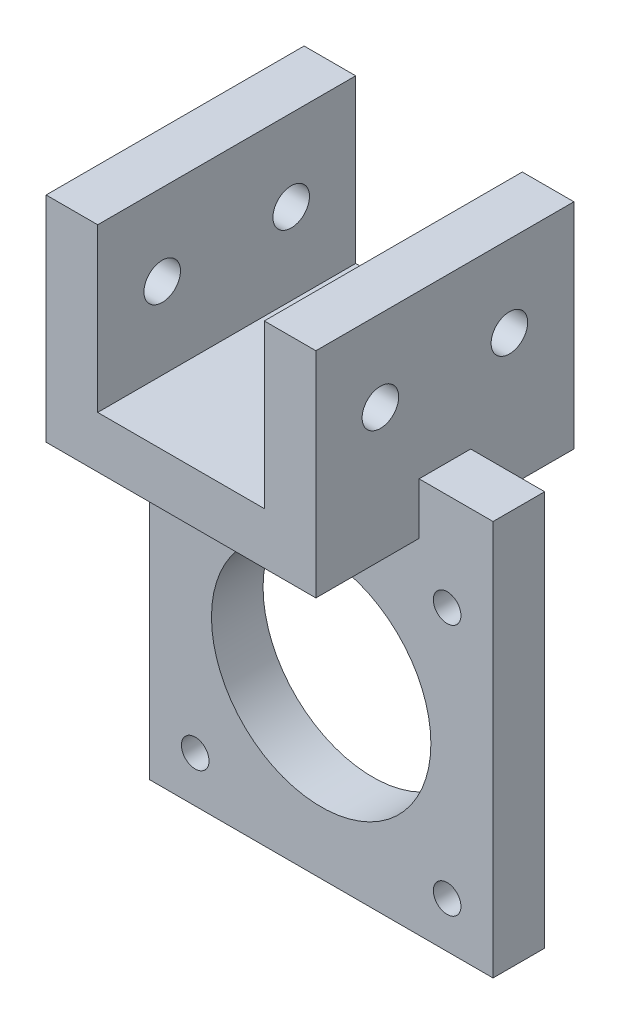
ISO-10303-21;
HEADER;
FILE_DESCRIPTION(('STEP AP214'),'2;1');
FILE_NAME('part.step','',(''),(''),'','','');
FILE_SCHEMA(('AUTOMOTIVE_DESIGN { 1 0 10303 214 1 1 1 1 }'));
ENDSEC;
DATA;
#1=APPLICATION_CONTEXT('core data for automotive mechanical design processes');
#2=APPLICATION_PROTOCOL_DEFINITION('international standard','automotive_design',2000,#1);
#3=PRODUCT_CONTEXT('',#1,'mechanical');
#4=PRODUCT('Part','Part','',(#3));
#5=PRODUCT_RELATED_PRODUCT_CATEGORY('part','',(#4));
#6=PRODUCT_DEFINITION_FORMATION('','',#4);
#7=PRODUCT_DEFINITION_CONTEXT('part definition',#1,'design');
#8=PRODUCT_DEFINITION('design','',#6,#7);
#9=PRODUCT_DEFINITION_SHAPE('','',#8);
#10=(LENGTH_UNIT() NAMED_UNIT(*) SI_UNIT(.MILLI.,.METRE.));
#11=(NAMED_UNIT(*) PLANE_ANGLE_UNIT() SI_UNIT($,.RADIAN.));
#12=(NAMED_UNIT(*) SI_UNIT($,.STERADIAN.) SOLID_ANGLE_UNIT());
#13=UNCERTAINTY_MEASURE_WITH_UNIT(LENGTH_MEASURE(1.E-05),#10,'distance_accuracy_value','');
#14=(GEOMETRIC_REPRESENTATION_CONTEXT(3) GLOBAL_UNCERTAINTY_ASSIGNED_CONTEXT((#13)) GLOBAL_UNIT_ASSIGNED_CONTEXT((#10,
#11,#12)) REPRESENTATION_CONTEXT('',''));
#15=CARTESIAN_POINT('',(0.,0.,0.));
#16=DIRECTION('',(0.,0.,1.));
#17=DIRECTION('',(1.,0.,0.));
#18=AXIS2_PLACEMENT_3D('',#15,#16,#17);
#19=CARTESIAN_POINT('',(0.,27.5,0.));
#20=DIRECTION('',(0.,1.,0.));
#21=DIRECTION('',(0.,0.,1.));
#22=AXIS2_PLACEMENT_3D('',#19,#20,#21);
#23=PLANE('',#22);
#24=DIRECTION('',(0.,0.,1.));
#25=VECTOR('',#24,1.);
#26=CARTESIAN_POINT('',(5.70000000000001,27.5,6.35));
#27=LINE('',#26,#25);
#28=CARTESIAN_POINT('',(5.70000000000001,27.5,-12.7));
#29=VERTEX_POINT('',#28);
#30=CARTESIAN_POINT('',(5.70000000000001,27.5,19.05));
#31=VERTEX_POINT('',#30);
#32=EDGE_CURVE('E146',#29,#31,#27,.T.);
#33=ORIENTED_EDGE('',*,*,#32,.F.);
#34=DIRECTION('',(1.,0.,0.));
#35=VECTOR('',#34,1.);
#36=CARTESIAN_POINT('',(-14.8,27.5,-12.7));
#37=LINE('',#36,#35);
#38=CARTESIAN_POINT('',(-14.8,27.5,-12.7));
#39=VERTEX_POINT('',#38);
#40=EDGE_CURVE('E179',#39,#29,#37,.T.);
#41=ORIENTED_EDGE('',*,*,#40,.F.);
#42=DIRECTION('',(0.,0.,-1.));
#43=VECTOR('',#42,1.);
#44=CARTESIAN_POINT('',(-14.8,27.5,0.));
#45=LINE('',#44,#43);
#46=CARTESIAN_POINT('',(-14.8,27.5,19.05));
#47=VERTEX_POINT('',#46);
#48=EDGE_CURVE('E215',#47,#39,#45,.T.);
#49=ORIENTED_EDGE('',*,*,#48,.F.);
#50=DIRECTION('',(1.,0.,0.));
#51=VECTOR('',#50,1.);
#52=CARTESIAN_POINT('',(-14.8,27.5,19.05));
#53=LINE('',#52,#51);
#54=EDGE_CURVE('E197',#47,#31,#53,.T.);
#55=ORIENTED_EDGE('',*,*,#54,.T.);
#56=EDGE_LOOP('',(#33,#41,#49,#55));
#57=FACE_BOUND('',#56,.T.);
#58=ADVANCED_FACE('F35',(#57),#23,.T.);
#59=DIRECTION('',(0.,0.,-1.));
#60=VECTOR('',#59,1.);
#61=CARTESIAN_POINT('',(12.05,27.5,6.35));
#62=LINE('',#61,#60);
#63=CARTESIAN_POINT('',(12.05,27.5,6.35));
#64=VERTEX_POINT('',#63);
#65=CARTESIAN_POINT('',(12.05,27.5,0.));
#66=VERTEX_POINT('',#65);
#67=EDGE_CURVE('E220',#64,#66,#62,.T.);
#68=ORIENTED_EDGE('',*,*,#67,.F.);
#69=DIRECTION('',(1.,0.,0.));
#70=VECTOR('',#69,1.);
#71=CARTESIAN_POINT('',(0.,27.5,6.35));
#72=LINE('',#71,#70);
#73=CARTESIAN_POINT('',(21.15,27.5,6.35));
#74=VERTEX_POINT('',#73);
#75=EDGE_CURVE('E231',#64,#74,#72,.T.);
#76=ORIENTED_EDGE('',*,*,#75,.T.);
#77=DIRECTION('',(0.,0.,-1.));
#78=VECTOR('',#77,1.);
#79=CARTESIAN_POINT('',(21.15,27.5,0.));
#80=LINE('',#79,#78);
#81=CARTESIAN_POINT('',(21.15,27.5,0.));
#82=VERTEX_POINT('',#81);
#83=EDGE_CURVE('E223',#74,#82,#80,.T.);
#84=ORIENTED_EDGE('',*,*,#83,.T.);
#85=DIRECTION('',(-1.,0.,0.));
#86=VECTOR('',#85,1.);
#87=CARTESIAN_POINT('',(0.,27.5,0.));
#88=LINE('',#87,#86);
#89=EDGE_CURVE('E228',#82,#66,#88,.T.);
#90=ORIENTED_EDGE('',*,*,#89,.T.);
#91=EDGE_LOOP('',(#68,#76,#84,#90));
#92=FACE_BOUND('',#91,.T.);
#93=ADVANCED_FACE('F323',(#92),#23,.T.);
#94=CARTESIAN_POINT('',(0.,-21.15,6.35));
#95=DIRECTION('',(0.,1.,0.));
#96=DIRECTION('',(0.,0.,1.));
#97=AXIS2_PLACEMENT_3D('',#94,#95,#96);
#98=PLANE('',#97);
#99=DIRECTION('',(1.,0.,0.));
#100=VECTOR('',#99,1.);
#101=CARTESIAN_POINT('',(0.,-21.15,0.));
#102=LINE('',#101,#100);
#103=CARTESIAN_POINT('',(-21.15,-21.15,0.));
#104=VERTEX_POINT('',#103);
#105=CARTESIAN_POINT('',(21.15,-21.15,0.));
#106=VERTEX_POINT('',#105);
#107=EDGE_CURVE('E273',#104,#106,#102,.T.);
#108=ORIENTED_EDGE('',*,*,#107,.T.);
#109=DIRECTION('',(0.,0.,-1.));
#110=VECTOR('',#109,1.);
#111=CARTESIAN_POINT('',(21.15,-21.15,6.35));
#112=LINE('',#111,#110);
#113=CARTESIAN_POINT('',(21.15,-21.15,6.35));
#114=VERTEX_POINT('',#113);
#115=EDGE_CURVE('E44',#114,#106,#112,.T.);
#116=ORIENTED_EDGE('',*,*,#115,.F.);
#117=DIRECTION('',(1.,0.,0.));
#118=VECTOR('',#117,1.);
#119=CARTESIAN_POINT('',(0.,-21.15,6.35));
#120=LINE('',#119,#118);
#121=CARTESIAN_POINT('',(-21.15,-21.15,6.35));
#122=VERTEX_POINT('',#121);
#123=EDGE_CURVE('E249',#122,#114,#120,.T.);
#124=ORIENTED_EDGE('',*,*,#123,.F.);
#125=DIRECTION('',(0.,0.,-1.));
#126=VECTOR('',#125,1.);
#127=CARTESIAN_POINT('',(-21.15,-21.15,6.35));
#128=LINE('',#127,#126);
#129=EDGE_CURVE('E258',#122,#104,#128,.T.);
#130=ORIENTED_EDGE('',*,*,#129,.T.);
#131=EDGE_LOOP('',(#108,#116,#124,#130));
#132=FACE_BOUND('',#131,.T.);
#133=ADVANCED_FACE('F328',(#132),#98,.F.);
#134=CARTESIAN_POINT('',(21.15,0.,6.35));
#135=DIRECTION('',(-1.,0.,0.));
#136=DIRECTION('',(0.,0.,1.));
#137=AXIS2_PLACEMENT_3D('',#134,#135,#136);
#138=PLANE('',#137);
#139=DIRECTION('',(0.,1.,0.));
#140=VECTOR('',#139,1.);
#141=CARTESIAN_POINT('',(21.15,0.,0.));
#142=LINE('',#141,#140);
#143=EDGE_CURVE('E276',#106,#82,#142,.T.);
#144=ORIENTED_EDGE('',*,*,#143,.T.);
#145=ORIENTED_EDGE('',*,*,#83,.F.);
#146=DIRECTION('',(0.,1.,0.));
#147=VECTOR('',#146,1.);
#148=CARTESIAN_POINT('',(21.15,0.,6.35));
#149=LINE('',#148,#147);
#150=EDGE_CURVE('E252',#114,#74,#149,.T.);
#151=ORIENTED_EDGE('',*,*,#150,.F.);
#152=ORIENTED_EDGE('',*,*,#115,.T.);
#153=EDGE_LOOP('',(#144,#145,#151,#152));
#154=FACE_BOUND('',#153,.T.);
#155=ADVANCED_FACE('F337',(#154),#138,.F.);
#156=CARTESIAN_POINT('',(-15.5,15.5,6.35));
#157=DIRECTION('',(0.,0.,-1.));
#158=DIRECTION('',(-1.,0.,0.));
#159=AXIS2_PLACEMENT_3D('',#156,#157,#158);
#160=CYLINDRICAL_SURFACE('',#159,1.7);
#161=CARTESIAN_POINT('',(-15.5,15.5,6.35));
#162=DIRECTION('',(0.,0.,1.));
#163=DIRECTION('',(1.,0.,0.));
#164=AXIS2_PLACEMENT_3D('',#161,#162,#163);
#165=CIRCLE('',#164,1.7);
#166=CARTESIAN_POINT('',(-13.8,15.5,6.35));
#167=VERTEX_POINT('',#166);
#168=EDGE_CURVE('E246',#167,#167,#165,.T.);
#169=ORIENTED_EDGE('',*,*,#168,.T.);
#170=EDGE_LOOP('',(#169));
#171=FACE_BOUND('',#170,.T.);
#172=CARTESIAN_POINT('',(-15.5,15.5,0.));
#173=DIRECTION('',(0.,0.,1.));
#174=DIRECTION('',(1.,0.,0.));
#175=AXIS2_PLACEMENT_3D('',#172,#173,#174);
#176=CIRCLE('',#175,1.7);
#177=CARTESIAN_POINT('',(-13.8,15.5,0.));
#178=VERTEX_POINT('',#177);
#179=EDGE_CURVE('E270',#178,#178,#176,.T.);
#180=ORIENTED_EDGE('',*,*,#179,.F.);
#181=EDGE_LOOP('',(#180));
#182=FACE_BOUND('',#181,.T.);
#183=ADVANCED_FACE('F340',(#171,#182),#160,.F.);
#184=CARTESIAN_POINT('',(0.,0.,6.35));
#185=DIRECTION('',(0.,0.,-1.));
#186=DIRECTION('',(-1.,0.,0.));
#187=AXIS2_PLACEMENT_3D('',#184,#185,#186);
#188=CYLINDRICAL_SURFACE('',#187,13.5);
#189=CARTESIAN_POINT('',(0.,0.,6.35));
#190=DIRECTION('',(0.,0.,1.));
#191=DIRECTION('',(1.,0.,0.));
#192=AXIS2_PLACEMENT_3D('',#189,#190,#191);
#193=CIRCLE('',#192,13.5);
#194=CARTESIAN_POINT('',(13.5,0.,6.35));
#195=VERTEX_POINT('',#194);
#196=EDGE_CURVE('E243',#195,#195,#193,.T.);
#197=ORIENTED_EDGE('',*,*,#196,.T.);
#198=EDGE_LOOP('',(#197));
#199=FACE_BOUND('',#198,.T.);
#200=CARTESIAN_POINT('',(0.,0.,0.));
#201=DIRECTION('',(0.,0.,1.));
#202=DIRECTION('',(1.,0.,0.));
#203=AXIS2_PLACEMENT_3D('',#200,#201,#202);
#204=CIRCLE('',#203,13.5);
#205=CARTESIAN_POINT('',(13.5,0.,0.));
#206=VERTEX_POINT('',#205);
#207=EDGE_CURVE('E267',#206,#206,#204,.T.);
#208=ORIENTED_EDGE('',*,*,#207,.F.);
#209=EDGE_LOOP('',(#208));
#210=FACE_BOUND('',#209,.T.);
#211=ADVANCED_FACE('F347',(#199,#210),#188,.F.);
#212=CARTESIAN_POINT('',(-15.5,-15.5,6.35));
#213=DIRECTION('',(0.,0.,-1.));
#214=DIRECTION('',(-1.,0.,0.));
#215=AXIS2_PLACEMENT_3D('',#212,#213,#214);
#216=CYLINDRICAL_SURFACE('',#215,1.7);
#217=CARTESIAN_POINT('',(-15.5,-15.5,6.35));
#218=DIRECTION('',(0.,0.,1.));
#219=DIRECTION('',(1.,0.,0.));
#220=AXIS2_PLACEMENT_3D('',#217,#218,#219);
#221=CIRCLE('',#220,1.7);
#222=CARTESIAN_POINT('',(-13.8,-15.5,6.35));
#223=VERTEX_POINT('',#222);
#224=EDGE_CURVE('E240',#223,#223,#221,.T.);
#225=ORIENTED_EDGE('',*,*,#224,.T.);
#226=EDGE_LOOP('',(#225));
#227=FACE_BOUND('',#226,.T.);
#228=CARTESIAN_POINT('',(-15.5,-15.5,0.));
#229=DIRECTION('',(0.,0.,1.));
#230=DIRECTION('',(1.,0.,0.));
#231=AXIS2_PLACEMENT_3D('',#228,#229,#230);
#232=CIRCLE('',#231,1.7);
#233=CARTESIAN_POINT('',(-13.8,-15.5,0.));
#234=VERTEX_POINT('',#233);
#235=EDGE_CURVE('E264',#234,#234,#232,.T.);
#236=ORIENTED_EDGE('',*,*,#235,.F.);
#237=EDGE_LOOP('',(#236));
#238=FACE_BOUND('',#237,.T.);
#239=ADVANCED_FACE('F351',(#227,#238),#216,.F.);
#240=CARTESIAN_POINT('',(15.5,15.5,6.35));
#241=DIRECTION('',(0.,0.,-1.));
#242=DIRECTION('',(-1.,0.,0.));
#243=AXIS2_PLACEMENT_3D('',#240,#241,#242);
#244=CYLINDRICAL_SURFACE('',#243,1.7);
#245=CARTESIAN_POINT('',(15.5,15.5,6.35));
#246=DIRECTION('',(0.,0.,1.));
#247=DIRECTION('',(1.,0.,0.));
#248=AXIS2_PLACEMENT_3D('',#245,#246,#247);
#249=CIRCLE('',#248,1.7);
#250=CARTESIAN_POINT('',(17.2,15.5,6.35));
#251=VERTEX_POINT('',#250);
#252=EDGE_CURVE('E237',#251,#251,#249,.T.);
#253=ORIENTED_EDGE('',*,*,#252,.T.);
#254=EDGE_LOOP('',(#253));
#255=FACE_BOUND('',#254,.T.);
#256=CARTESIAN_POINT('',(15.5,15.5,0.));
#257=DIRECTION('',(0.,0.,1.));
#258=DIRECTION('',(1.,0.,0.));
#259=AXIS2_PLACEMENT_3D('',#256,#257,#258);
#260=CIRCLE('',#259,1.7);
#261=CARTESIAN_POINT('',(17.2,15.5,0.));
#262=VERTEX_POINT('',#261);
#263=EDGE_CURVE('E261',#262,#262,#260,.T.);
#264=ORIENTED_EDGE('',*,*,#263,.F.);
#265=EDGE_LOOP('',(#264));
#266=FACE_BOUND('',#265,.T.);
#267=ADVANCED_FACE('F354',(#255,#266),#244,.F.);
#268=CARTESIAN_POINT('',(15.5,-15.5,6.35));
#269=DIRECTION('',(0.,0.,-1.));
#270=DIRECTION('',(-1.,0.,0.));
#271=AXIS2_PLACEMENT_3D('',#268,#269,#270);
#272=CYLINDRICAL_SURFACE('',#271,1.7);
#273=CARTESIAN_POINT('',(15.5,-15.5,6.35));
#274=DIRECTION('',(0.,0.,1.));
#275=DIRECTION('',(1.,0.,0.));
#276=AXIS2_PLACEMENT_3D('',#273,#274,#275);
#277=CIRCLE('',#276,1.7);
#278=CARTESIAN_POINT('',(17.2,-15.5,6.35));
#279=VERTEX_POINT('',#278);
#280=EDGE_CURVE('E234',#279,#279,#277,.T.);
#281=ORIENTED_EDGE('',*,*,#280,.T.);
#282=EDGE_LOOP('',(#281));
#283=FACE_BOUND('',#282,.T.);
#284=CARTESIAN_POINT('',(15.5,-15.5,0.));
#285=DIRECTION('',(0.,0.,1.));
#286=DIRECTION('',(1.,0.,0.));
#287=AXIS2_PLACEMENT_3D('',#284,#285,#286);
#288=CIRCLE('',#287,1.7);
#289=CARTESIAN_POINT('',(17.2,-15.5,0.));
#290=VERTEX_POINT('',#289);
#291=EDGE_CURVE('E233',#290,#290,#288,.T.);
#292=ORIENTED_EDGE('',*,*,#291,.F.);
#293=EDGE_LOOP('',(#292));
#294=FACE_BOUND('',#293,.T.);
#295=ADVANCED_FACE('F37',(#283,#294),#272,.F.);
#296=CARTESIAN_POINT('',(-21.15,0.,6.35));
#297=DIRECTION('',(-1.,0.,0.));
#298=DIRECTION('',(0.,0.,1.));
#299=AXIS2_PLACEMENT_3D('',#296,#297,#298);
#300=PLANE('',#299);
#301=CARTESIAN_POINT('',(-21.15,37.5,-4.76249999999999));
#302=DIRECTION('',(1.,0.,0.));
#303=DIRECTION('',(0.,0.,-1.));
#304=AXIS2_PLACEMENT_3D('',#301,#302,#303);
#305=CIRCLE('',#304,2.25);
#306=CARTESIAN_POINT('',(-21.15,37.5,-7.01249999999999));
#307=VERTEX_POINT('',#306);
#308=EDGE_CURVE('E284',#307,#307,#305,.T.);
#309=ORIENTED_EDGE('',*,*,#308,.T.);
#310=EDGE_LOOP('',(#309));
#311=FACE_BOUND('',#310,.T.);
#312=CARTESIAN_POINT('',(-21.15,37.5,11.1125));
#313=DIRECTION('',(1.,0.,0.));
#314=DIRECTION('',(0.,0.,-1.));
#315=AXIS2_PLACEMENT_3D('',#312,#313,#314);
#316=CIRCLE('',#315,2.25);
#317=CARTESIAN_POINT('',(-21.15,37.5,8.86250000000001));
#318=VERTEX_POINT('',#317);
#319=EDGE_CURVE('E294',#318,#318,#316,.T.);
#320=ORIENTED_EDGE('',*,*,#319,.T.);
#321=EDGE_LOOP('',(#320));
#322=FACE_BOUND('',#321,.T.);
#323=DIRECTION('',(0.,1.,0.));
#324=VECTOR('',#323,1.);
#325=CARTESIAN_POINT('',(-21.15,0.,6.35));
#326=LINE('',#325,#324);
#327=CARTESIAN_POINT('',(-21.15,21.15,6.35));
#328=VERTEX_POINT('',#327);
#329=EDGE_CURVE('E255',#122,#328,#326,.T.);
#330=ORIENTED_EDGE('',*,*,#329,.T.);
#331=DIRECTION('',(0.,0.,-1.));
#332=VECTOR('',#331,1.);
#333=CARTESIAN_POINT('',(-21.15,21.15,19.05));
#334=LINE('',#333,#332);
#335=CARTESIAN_POINT('',(-21.15,21.15,19.05));
#336=VERTEX_POINT('',#335);
#337=EDGE_CURVE('E203',#336,#328,#334,.T.);
#338=ORIENTED_EDGE('',*,*,#337,.F.);
#339=DIRECTION('',(0.,1.,0.));
#340=VECTOR('',#339,1.);
#341=CARTESIAN_POINT('',(-21.15,21.15,19.05));
#342=LINE('',#341,#340);
#343=CARTESIAN_POINT('',(-21.15,47.5,19.05));
#344=VERTEX_POINT('',#343);
#345=EDGE_CURVE('E188',#336,#344,#342,.T.);
#346=ORIENTED_EDGE('',*,*,#345,.T.);
#347=DIRECTION('',(0.,0.,1.));
#348=VECTOR('',#347,1.);
#349=CARTESIAN_POINT('',(-21.15,47.5,0.));
#350=LINE('',#349,#348);
#351=CARTESIAN_POINT('',(-21.15,47.5,-12.7));
#352=VERTEX_POINT('',#351);
#353=EDGE_CURVE('E216',#352,#344,#350,.T.);
#354=ORIENTED_EDGE('',*,*,#353,.F.);
#355=DIRECTION('',(0.,1.,0.));
#356=VECTOR('',#355,1.);
#357=CARTESIAN_POINT('',(-21.15,21.15,-12.7));
#358=LINE('',#357,#356);
#359=CARTESIAN_POINT('',(-21.15,21.15,-12.7));
#360=VERTEX_POINT('',#359);
#361=EDGE_CURVE('E170',#360,#352,#358,.T.);
#362=ORIENTED_EDGE('',*,*,#361,.F.);
#363=CARTESIAN_POINT('',(-21.15,21.15,0.));
#364=VERTEX_POINT('',#363);
#365=EDGE_CURVE('E206',#364,#360,#334,.T.);
#366=ORIENTED_EDGE('',*,*,#365,.F.);
#367=DIRECTION('',(0.,1.,0.));
#368=VECTOR('',#367,1.);
#369=CARTESIAN_POINT('',(-21.15,0.,0.));
#370=LINE('',#369,#368);
#371=EDGE_CURVE('E55',#104,#364,#370,.T.);
#372=ORIENTED_EDGE('',*,*,#371,.F.);
#373=ORIENTED_EDGE('',*,*,#129,.F.);
#374=EDGE_LOOP('',(#330,#338,#346,#354,#362,#366,#372,#373));
#375=FACE_BOUND('',#374,.T.);
#376=ADVANCED_FACE('F332',(#311,#322,#375),#300,.T.);
#377=CARTESIAN_POINT('',(0.,0.,6.35));
#378=DIRECTION('',(0.,0.,1.));
#379=DIRECTION('',(1.,0.,0.));
#380=AXIS2_PLACEMENT_3D('',#377,#378,#379);
#381=PLANE('',#380);
#382=DIRECTION('',(1.,0.,0.));
#383=VECTOR('',#382,1.);
#384=CARTESIAN_POINT('',(0.,21.15,6.35));
#385=LINE('',#384,#383);
#386=CARTESIAN_POINT('',(12.05,21.15,6.35));
#387=VERTEX_POINT('',#386);
#388=EDGE_CURVE('E213',#328,#387,#385,.T.);
#389=ORIENTED_EDGE('',*,*,#388,.F.);
#390=ORIENTED_EDGE('',*,*,#329,.F.);
#391=ORIENTED_EDGE('',*,*,#123,.T.);
#392=ORIENTED_EDGE('',*,*,#150,.T.);
#393=ORIENTED_EDGE('',*,*,#75,.F.);
#394=DIRECTION('',(0.,1.,0.));
#395=VECTOR('',#394,1.);
#396=CARTESIAN_POINT('',(12.05,0.,6.35));
#397=LINE('',#396,#395);
#398=EDGE_CURVE('E211',#387,#64,#397,.T.);
#399=ORIENTED_EDGE('',*,*,#398,.F.);
#400=EDGE_LOOP('',(#389,#390,#391,#392,#393,#399));
#401=FACE_BOUND('',#400,.T.);
#402=ORIENTED_EDGE('',*,*,#280,.F.);
#403=EDGE_LOOP('',(#402));
#404=FACE_BOUND('',#403,.T.);
#405=ORIENTED_EDGE('',*,*,#252,.F.);
#406=EDGE_LOOP('',(#405));
#407=FACE_BOUND('',#406,.T.);
#408=ORIENTED_EDGE('',*,*,#224,.F.);
#409=EDGE_LOOP('',(#408));
#410=FACE_BOUND('',#409,.T.);
#411=ORIENTED_EDGE('',*,*,#196,.F.);
#412=EDGE_LOOP('',(#411));
#413=FACE_BOUND('',#412,.T.);
#414=ORIENTED_EDGE('',*,*,#168,.F.);
#415=EDGE_LOOP('',(#414));
#416=FACE_BOUND('',#415,.T.);
#417=ADVANCED_FACE('F317',(#401,#404,#407,#410,#413,#416),#381,.T.);
#418=CARTESIAN_POINT('',(0.,0.,0.));
#419=DIRECTION('',(0.,0.,1.));
#420=DIRECTION('',(1.,0.,0.));
#421=AXIS2_PLACEMENT_3D('',#418,#419,#420);
#422=PLANE('',#421);
#423=ORIENTED_EDGE('',*,*,#291,.T.);
#424=EDGE_LOOP('',(#423));
#425=FACE_BOUND('',#424,.T.);
#426=ORIENTED_EDGE('',*,*,#263,.T.);
#427=EDGE_LOOP('',(#426));
#428=FACE_BOUND('',#427,.T.);
#429=ORIENTED_EDGE('',*,*,#235,.T.);
#430=EDGE_LOOP('',(#429));
#431=FACE_BOUND('',#430,.T.);
#432=ORIENTED_EDGE('',*,*,#207,.T.);
#433=EDGE_LOOP('',(#432));
#434=FACE_BOUND('',#433,.T.);
#435=ORIENTED_EDGE('',*,*,#179,.T.);
#436=EDGE_LOOP('',(#435));
#437=FACE_BOUND('',#436,.T.);
#438=ORIENTED_EDGE('',*,*,#371,.T.);
#439=DIRECTION('',(1.,0.,0.));
#440=VECTOR('',#439,1.);
#441=CARTESIAN_POINT('',(0.,21.15,0.));
#442=LINE('',#441,#440);
#443=CARTESIAN_POINT('',(12.05,21.15,0.));
#444=VERTEX_POINT('',#443);
#445=EDGE_CURVE('E11',#364,#444,#442,.T.);
#446=ORIENTED_EDGE('',*,*,#445,.T.);
#447=DIRECTION('',(0.,1.,0.));
#448=VECTOR('',#447,1.);
#449=CARTESIAN_POINT('',(12.05,0.,0.));
#450=LINE('',#449,#448);
#451=EDGE_CURVE('E205',#444,#66,#450,.T.);
#452=ORIENTED_EDGE('',*,*,#451,.T.);
#453=ORIENTED_EDGE('',*,*,#89,.F.);
#454=ORIENTED_EDGE('',*,*,#143,.F.);
#455=ORIENTED_EDGE('',*,*,#107,.F.);
#456=EDGE_LOOP('',(#438,#446,#452,#453,#454,#455));
#457=FACE_BOUND('',#456,.T.);
#458=ADVANCED_FACE('F308',(#425,#428,#431,#434,#437,#457),#422,.F.);
#459=CARTESIAN_POINT('',(12.05,47.5,6.35));
#460=DIRECTION('',(-1.,0.,0.));
#461=DIRECTION('',(0.,0.,1.));
#462=AXIS2_PLACEMENT_3D('',#459,#460,#461);
#463=PLANE('',#462);
#464=CARTESIAN_POINT('',(12.05,37.5,-4.7625));
#465=DIRECTION('',(1.,0.,0.));
#466=DIRECTION('',(0.,0.,-1.));
#467=AXIS2_PLACEMENT_3D('',#464,#465,#466);
#468=CIRCLE('',#467,2.25);
#469=CARTESIAN_POINT('',(12.05,37.5,-7.0125));
#470=VERTEX_POINT('',#469);
#471=EDGE_CURVE('E289',#470,#470,#468,.T.);
#472=ORIENTED_EDGE('',*,*,#471,.F.);
#473=EDGE_LOOP('',(#472));
#474=FACE_BOUND('',#473,.T.);
#475=CARTESIAN_POINT('',(12.05,37.5,11.1125));
#476=DIRECTION('',(1.,0.,0.));
#477=DIRECTION('',(0.,0.,-1.));
#478=AXIS2_PLACEMENT_3D('',#475,#476,#477);
#479=CIRCLE('',#478,2.25);
#480=CARTESIAN_POINT('',(12.05,37.5,8.8625));
#481=VERTEX_POINT('',#480);
#482=EDGE_CURVE('E299',#481,#481,#479,.T.);
#483=ORIENTED_EDGE('',*,*,#482,.F.);
#484=EDGE_LOOP('',(#483));
#485=FACE_BOUND('',#484,.T.);
#486=ORIENTED_EDGE('',*,*,#67,.T.);
#487=ORIENTED_EDGE('',*,*,#451,.F.);
#488=DIRECTION('',(0.,0.,-1.));
#489=VECTOR('',#488,1.);
#490=CARTESIAN_POINT('',(12.05,21.15,19.05));
#491=LINE('',#490,#489);
#492=CARTESIAN_POINT('',(12.05,21.15,-12.7));
#493=VERTEX_POINT('',#492);
#494=EDGE_CURVE('E152',#444,#493,#491,.T.);
#495=ORIENTED_EDGE('',*,*,#494,.T.);
#496=DIRECTION('',(0.,-1.,0.));
#497=VECTOR('',#496,1.);
#498=CARTESIAN_POINT('',(12.05,47.5,-12.7));
#499=LINE('',#498,#497);
#500=CARTESIAN_POINT('',(12.05,47.5,-12.7));
#501=VERTEX_POINT('',#500);
#502=EDGE_CURVE('E149',#501,#493,#499,.T.);
#503=ORIENTED_EDGE('',*,*,#502,.F.);
#504=DIRECTION('',(0.,0.,-1.));
#505=VECTOR('',#504,1.);
#506=CARTESIAN_POINT('',(12.05,47.5,6.35));
#507=LINE('',#506,#505);
#508=CARTESIAN_POINT('',(12.05,47.5,19.05));
#509=VERTEX_POINT('',#508);
#510=EDGE_CURVE('E136',#509,#501,#507,.T.);
#511=ORIENTED_EDGE('',*,*,#510,.F.);
#512=DIRECTION('',(0.,-1.,0.));
#513=VECTOR('',#512,1.);
#514=CARTESIAN_POINT('',(12.05,47.5,19.05));
#515=LINE('',#514,#513);
#516=CARTESIAN_POINT('',(12.05,21.15,19.05));
#517=VERTEX_POINT('',#516);
#518=EDGE_CURVE('E183',#509,#517,#515,.T.);
#519=ORIENTED_EDGE('',*,*,#518,.T.);
#520=EDGE_CURVE('E207',#517,#387,#491,.T.);
#521=ORIENTED_EDGE('',*,*,#520,.T.);
#522=ORIENTED_EDGE('',*,*,#398,.T.);
#523=EDGE_LOOP('',(#486,#487,#495,#503,#511,#519,#521,#522));
#524=FACE_BOUND('',#523,.T.);
#525=ADVANCED_FACE('F150',(#474,#485,#524),#463,.F.);
#526=CARTESIAN_POINT('',(5.70000000000001,47.5,6.35));
#527=DIRECTION('',(1.,0.,0.));
#528=DIRECTION('',(0.,0.,-1.));
#529=AXIS2_PLACEMENT_3D('',#526,#527,#528);
#530=PLANE('',#529);
#531=CARTESIAN_POINT('',(5.70000000000001,37.5,-4.7625));
#532=DIRECTION('',(1.,0.,0.));
#533=DIRECTION('',(0.,0.,-1.));
#534=AXIS2_PLACEMENT_3D('',#531,#532,#533);
#535=CIRCLE('',#534,2.25);
#536=CARTESIAN_POINT('',(5.70000000000001,37.5,-7.0125));
#537=VERTEX_POINT('',#536);
#538=EDGE_CURVE('E163',#537,#537,#535,.T.);
#539=ORIENTED_EDGE('',*,*,#538,.T.);
#540=EDGE_LOOP('',(#539));
#541=FACE_BOUND('',#540,.T.);
#542=CARTESIAN_POINT('',(5.70000000000001,37.5,11.1125));
#543=DIRECTION('',(1.,0.,0.));
#544=DIRECTION('',(0.,0.,-1.));
#545=AXIS2_PLACEMENT_3D('',#542,#543,#544);
#546=CIRCLE('',#545,2.25);
#547=CARTESIAN_POINT('',(5.70000000000001,37.5,8.8625));
#548=VERTEX_POINT('',#547);
#549=EDGE_CURVE('E283',#548,#548,#546,.T.);
#550=ORIENTED_EDGE('',*,*,#549,.T.);
#551=EDGE_LOOP('',(#550));
#552=FACE_BOUND('',#551,.T.);
#553=ORIENTED_EDGE('',*,*,#32,.T.);
#554=DIRECTION('',(0.,1.,0.));
#555=VECTOR('',#554,1.);
#556=CARTESIAN_POINT('',(5.70000000000001,27.5,19.05));
#557=LINE('',#556,#555);
#558=CARTESIAN_POINT('',(5.70000000000001,47.5,19.05));
#559=VERTEX_POINT('',#558);
#560=EDGE_CURVE('E200',#31,#559,#557,.T.);
#561=ORIENTED_EDGE('',*,*,#560,.T.);
#562=DIRECTION('',(0.,0.,1.));
#563=VECTOR('',#562,1.);
#564=CARTESIAN_POINT('',(5.70000000000001,47.5,6.35));
#565=LINE('',#564,#563);
#566=CARTESIAN_POINT('',(5.70000000000001,47.5,-12.7));
#567=VERTEX_POINT('',#566);
#568=EDGE_CURVE('E145',#567,#559,#565,.T.);
#569=ORIENTED_EDGE('',*,*,#568,.F.);
#570=DIRECTION('',(0.,1.,0.));
#571=VECTOR('',#570,1.);
#572=CARTESIAN_POINT('',(5.70000000000001,27.5,-12.7));
#573=LINE('',#572,#571);
#574=EDGE_CURVE('E162',#29,#567,#573,.T.);
#575=ORIENTED_EDGE('',*,*,#574,.F.);
#576=EDGE_LOOP('',(#553,#561,#569,#575));
#577=FACE_BOUND('',#576,.T.);
#578=ADVANCED_FACE('F307',(#541,#552,#577),#530,.F.);
#579=CARTESIAN_POINT('',(0.,47.5,0.));
#580=DIRECTION('',(0.,1.,0.));
#581=DIRECTION('',(0.,0.,1.));
#582=AXIS2_PLACEMENT_3D('',#579,#580,#581);
#583=PLANE('',#582);
#584=ORIENTED_EDGE('',*,*,#510,.T.);
#585=DIRECTION('',(1.,0.,0.));
#586=VECTOR('',#585,1.);
#587=CARTESIAN_POINT('',(12.05,47.5,-12.7));
#588=LINE('',#587,#586);
#589=EDGE_CURVE('E140',#567,#501,#588,.T.);
#590=ORIENTED_EDGE('',*,*,#589,.F.);
#591=ORIENTED_EDGE('',*,*,#568,.T.);
#592=DIRECTION('',(1.,0.,0.));
#593=VECTOR('',#592,1.);
#594=CARTESIAN_POINT('',(12.05,47.5,19.05));
#595=LINE('',#594,#593);
#596=EDGE_CURVE('E142',#559,#509,#595,.T.);
#597=ORIENTED_EDGE('',*,*,#596,.T.);
#598=EDGE_LOOP('',(#584,#590,#591,#597));
#599=FACE_BOUND('',#598,.T.);
#600=ADVANCED_FACE('F138',(#599),#583,.T.);
#601=CARTESIAN_POINT('',(-14.8,47.5,0.));
#602=DIRECTION('',(-1.,0.,0.));
#603=DIRECTION('',(0.,0.,1.));
#604=AXIS2_PLACEMENT_3D('',#601,#602,#603);
#605=PLANE('',#604);
#606=CARTESIAN_POINT('',(-14.8,37.5,-4.76249999999999));
#607=DIRECTION('',(-1.,0.,0.));
#608=DIRECTION('',(0.,0.,1.));
#609=AXIS2_PLACEMENT_3D('',#606,#607,#608);
#610=CIRCLE('',#609,2.25);
#611=CARTESIAN_POINT('',(-14.8,37.5,-2.51249999999999));
#612=VERTEX_POINT('',#611);
#613=EDGE_CURVE('E39',#612,#612,#610,.T.);
#614=ORIENTED_EDGE('',*,*,#613,.T.);
#615=EDGE_LOOP('',(#614));
#616=FACE_BOUND('',#615,.T.);
#617=CARTESIAN_POINT('',(-14.8,37.5,11.1125));
#618=DIRECTION('',(-1.,0.,0.));
#619=DIRECTION('',(0.,0.,1.));
#620=AXIS2_PLACEMENT_3D('',#617,#618,#619);
#621=CIRCLE('',#620,2.25);
#622=CARTESIAN_POINT('',(-14.8,37.5,13.3625));
#623=VERTEX_POINT('',#622);
#624=EDGE_CURVE('E281',#623,#623,#621,.T.);
#625=ORIENTED_EDGE('',*,*,#624,.T.);
#626=EDGE_LOOP('',(#625));
#627=FACE_BOUND('',#626,.T.);
#628=ORIENTED_EDGE('',*,*,#48,.T.);
#629=DIRECTION('',(0.,-1.,0.));
#630=VECTOR('',#629,1.);
#631=CARTESIAN_POINT('',(-14.8,47.5,-12.7));
#632=LINE('',#631,#630);
#633=CARTESIAN_POINT('',(-14.8,47.5,-12.7));
#634=VERTEX_POINT('',#633);
#635=EDGE_CURVE('E176',#634,#39,#632,.T.);
#636=ORIENTED_EDGE('',*,*,#635,.F.);
#637=DIRECTION('',(0.,0.,-1.));
#638=VECTOR('',#637,1.);
#639=CARTESIAN_POINT('',(-14.8,47.5,0.));
#640=LINE('',#639,#638);
#641=CARTESIAN_POINT('',(-14.8,47.5,19.05));
#642=VERTEX_POINT('',#641);
#643=EDGE_CURVE('E218',#642,#634,#640,.T.);
#644=ORIENTED_EDGE('',*,*,#643,.F.);
#645=DIRECTION('',(0.,-1.,0.));
#646=VECTOR('',#645,1.);
#647=CARTESIAN_POINT('',(-14.8,47.5,19.05));
#648=LINE('',#647,#646);
#649=EDGE_CURVE('E194',#642,#47,#648,.T.);
#650=ORIENTED_EDGE('',*,*,#649,.T.);
#651=EDGE_LOOP('',(#628,#636,#644,#650));
#652=FACE_BOUND('',#651,.T.);
#653=ADVANCED_FACE('F414',(#616,#627,#652),#605,.F.);
#654=CARTESIAN_POINT('',(0.,47.5,0.));
#655=DIRECTION('',(0.,1.,0.));
#656=DIRECTION('',(0.,0.,1.));
#657=AXIS2_PLACEMENT_3D('',#654,#655,#656);
#658=PLANE('',#657);
#659=ORIENTED_EDGE('',*,*,#353,.T.);
#660=DIRECTION('',(1.,0.,0.));
#661=VECTOR('',#660,1.);
#662=CARTESIAN_POINT('',(-21.15,47.5,19.05));
#663=LINE('',#662,#661);
#664=EDGE_CURVE('E191',#344,#642,#663,.T.);
#665=ORIENTED_EDGE('',*,*,#664,.T.);
#666=ORIENTED_EDGE('',*,*,#643,.T.);
#667=DIRECTION('',(1.,0.,0.));
#668=VECTOR('',#667,1.);
#669=CARTESIAN_POINT('',(-21.15,47.5,-12.7));
#670=LINE('',#669,#668);
#671=EDGE_CURVE('E173',#352,#634,#670,.T.);
#672=ORIENTED_EDGE('',*,*,#671,.F.);
#673=EDGE_LOOP('',(#659,#665,#666,#672));
#674=FACE_BOUND('',#673,.T.);
#675=ADVANCED_FACE('F423',(#674),#658,.T.);
#676=CARTESIAN_POINT('',(0.,0.,-12.7));
#677=DIRECTION('',(0.,0.,-1.));
#678=DIRECTION('',(-1.,0.,0.));
#679=AXIS2_PLACEMENT_3D('',#676,#677,#678);
#680=PLANE('',#679);
#681=ORIENTED_EDGE('',*,*,#589,.T.);
#682=ORIENTED_EDGE('',*,*,#502,.T.);
#683=DIRECTION('',(-1.,0.,0.));
#684=VECTOR('',#683,1.);
#685=CARTESIAN_POINT('',(12.05,21.15,-12.7));
#686=LINE('',#685,#684);
#687=EDGE_CURVE('E156',#493,#360,#686,.T.);
#688=ORIENTED_EDGE('',*,*,#687,.T.);
#689=ORIENTED_EDGE('',*,*,#361,.T.);
#690=ORIENTED_EDGE('',*,*,#671,.T.);
#691=ORIENTED_EDGE('',*,*,#635,.T.);
#692=ORIENTED_EDGE('',*,*,#40,.T.);
#693=ORIENTED_EDGE('',*,*,#574,.T.);
#694=EDGE_LOOP('',(#681,#682,#688,#689,#690,#691,#692,#693));
#695=FACE_BOUND('',#694,.T.);
#696=ADVANCED_FACE('F159',(#695),#680,.T.);
#697=CARTESIAN_POINT('',(12.05,21.15,19.05));
#698=DIRECTION('',(0.,-1.,0.));
#699=DIRECTION('',(0.,0.,-1.));
#700=AXIS2_PLACEMENT_3D('',#697,#698,#699);
#701=PLANE('',#700);
#702=ORIENTED_EDGE('',*,*,#445,.F.);
#703=ORIENTED_EDGE('',*,*,#365,.T.);
#704=ORIENTED_EDGE('',*,*,#687,.F.);
#705=ORIENTED_EDGE('',*,*,#494,.F.);
#706=EDGE_LOOP('',(#702,#703,#704,#705));
#707=FACE_BOUND('',#706,.T.);
#708=ADVANCED_FACE('F438',(#707),#701,.T.);
#709=ORIENTED_EDGE('',*,*,#337,.T.);
#710=ORIENTED_EDGE('',*,*,#388,.T.);
#711=ORIENTED_EDGE('',*,*,#520,.F.);
#712=DIRECTION('',(-1.,0.,0.));
#713=VECTOR('',#712,1.);
#714=CARTESIAN_POINT('',(12.05,21.15,19.05));
#715=LINE('',#714,#713);
#716=EDGE_CURVE('E185',#517,#336,#715,.T.);
#717=ORIENTED_EDGE('',*,*,#716,.T.);
#718=EDGE_LOOP('',(#709,#710,#711,#717));
#719=FACE_BOUND('',#718,.T.);
#720=ADVANCED_FACE('F447',(#719),#701,.T.);
#721=CARTESIAN_POINT('',(0.,0.,19.05));
#722=DIRECTION('',(0.,0.,-1.));
#723=DIRECTION('',(-1.,0.,0.));
#724=AXIS2_PLACEMENT_3D('',#721,#722,#723);
#725=PLANE('',#724);
#726=ORIENTED_EDGE('',*,*,#596,.F.);
#727=ORIENTED_EDGE('',*,*,#560,.F.);
#728=ORIENTED_EDGE('',*,*,#54,.F.);
#729=ORIENTED_EDGE('',*,*,#649,.F.);
#730=ORIENTED_EDGE('',*,*,#664,.F.);
#731=ORIENTED_EDGE('',*,*,#345,.F.);
#732=ORIENTED_EDGE('',*,*,#716,.F.);
#733=ORIENTED_EDGE('',*,*,#518,.F.);
#734=EDGE_LOOP('',(#726,#727,#728,#729,#730,#731,#732,#733));
#735=FACE_BOUND('',#734,.T.);
#736=ADVANCED_FACE('F456',(#735),#725,.F.);
#737=CARTESIAN_POINT('',(-21.15,37.5,11.1125));
#738=DIRECTION('',(1.,0.,0.));
#739=DIRECTION('',(0.,0.,-1.));
#740=AXIS2_PLACEMENT_3D('',#737,#738,#739);
#741=CYLINDRICAL_SURFACE('',#740,2.25);
#742=ORIENTED_EDGE('',*,*,#319,.F.);
#743=EDGE_LOOP('',(#742));
#744=FACE_BOUND('',#743,.T.);
#745=ORIENTED_EDGE('',*,*,#624,.F.);
#746=EDGE_LOOP('',(#745));
#747=FACE_BOUND('',#746,.T.);
#748=ADVANCED_FACE('F464',(#744,#747),#741,.F.);
#749=CARTESIAN_POINT('',(-21.15,37.5,-4.76249999999999));
#750=DIRECTION('',(1.,0.,0.));
#751=DIRECTION('',(0.,0.,-1.));
#752=AXIS2_PLACEMENT_3D('',#749,#750,#751);
#753=CYLINDRICAL_SURFACE('',#752,2.25);
#754=ORIENTED_EDGE('',*,*,#308,.F.);
#755=EDGE_LOOP('',(#754));
#756=FACE_BOUND('',#755,.T.);
#757=ORIENTED_EDGE('',*,*,#613,.F.);
#758=EDGE_LOOP('',(#757));
#759=FACE_BOUND('',#758,.T.);
#760=ADVANCED_FACE('F475',(#756,#759),#753,.F.);
#761=ORIENTED_EDGE('',*,*,#482,.T.);
#762=EDGE_LOOP('',(#761));
#763=FACE_BOUND('',#762,.T.);
#764=ORIENTED_EDGE('',*,*,#549,.F.);
#765=EDGE_LOOP('',(#764));
#766=FACE_BOUND('',#765,.T.);
#767=ADVANCED_FACE('F303',(#763,#766),#741,.F.);
#768=ORIENTED_EDGE('',*,*,#471,.T.);
#769=EDGE_LOOP('',(#768));
#770=FACE_BOUND('',#769,.T.);
#771=ORIENTED_EDGE('',*,*,#538,.F.);
#772=EDGE_LOOP('',(#771));
#773=FACE_BOUND('',#772,.T.);
#774=ADVANCED_FACE('F485',(#770,#773),#753,.F.);
#775=CLOSED_SHELL('',(#58,#93,#133,#155,#183,#211,#239,#267,#295,#376,#417,#458,#525,#578,#600,
#653,#675,#696,#708,#720,#736,#748,#760,#767,#774));
#776=MANIFOLD_SOLID_BREP('B2',#775);
#777=ADVANCED_BREP_SHAPE_REPRESENTATION('',(#18,#776),#14);
#778=SHAPE_DEFINITION_REPRESENTATION(#9,#777);
ENDSEC;
END-ISO-10303-21;
